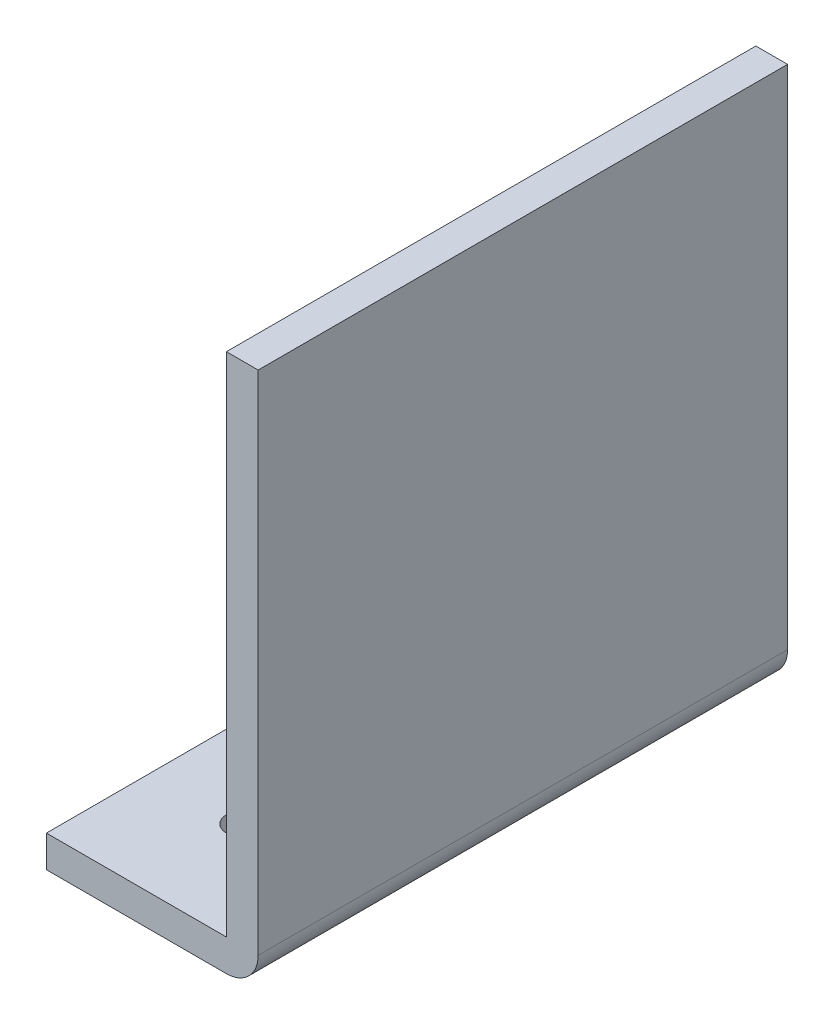
ISO-10303-21;
HEADER;
FILE_DESCRIPTION(('STEP AP214'),'2;1');
FILE_NAME('part.step','',(''),(''),'','','');
FILE_SCHEMA(('AUTOMOTIVE_DESIGN { 1 0 10303 214 1 1 1 1 }'));
ENDSEC;
DATA;
#1=APPLICATION_CONTEXT('core data for automotive mechanical design processes');
#2=APPLICATION_PROTOCOL_DEFINITION('international standard','automotive_design',2000,#1);
#3=PRODUCT_CONTEXT('',#1,'mechanical');
#4=PRODUCT('Part','Part','',(#3));
#5=PRODUCT_RELATED_PRODUCT_CATEGORY('part','',(#4));
#6=PRODUCT_DEFINITION_FORMATION('','',#4);
#7=PRODUCT_DEFINITION_CONTEXT('part definition',#1,'design');
#8=PRODUCT_DEFINITION('design','',#6,#7);
#9=PRODUCT_DEFINITION_SHAPE('','',#8);
#10=(LENGTH_UNIT() NAMED_UNIT(*) SI_UNIT(.MILLI.,.METRE.));
#11=(NAMED_UNIT(*) PLANE_ANGLE_UNIT() SI_UNIT($,.RADIAN.));
#12=(NAMED_UNIT(*) SI_UNIT($,.STERADIAN.) SOLID_ANGLE_UNIT());
#13=UNCERTAINTY_MEASURE_WITH_UNIT(LENGTH_MEASURE(1.E-05),#10,'distance_accuracy_value','');
#14=(GEOMETRIC_REPRESENTATION_CONTEXT(3) GLOBAL_UNCERTAINTY_ASSIGNED_CONTEXT((#13)) GLOBAL_UNIT_ASSIGNED_CONTEXT((#10,
#11,#12)) REPRESENTATION_CONTEXT('',''));
#15=CARTESIAN_POINT('',(0.,0.,0.));
#16=DIRECTION('',(0.,0.,1.));
#17=DIRECTION('',(1.,0.,0.));
#18=AXIS2_PLACEMENT_3D('',#15,#16,#17);
#19=CARTESIAN_POINT('',(-20.,3.,25.));
#20=DIRECTION('',(1.,0.,0.));
#21=DIRECTION('',(0.,0.,-1.));
#22=AXIS2_PLACEMENT_3D('',#19,#20,#21);
#23=PLANE('',#22);
#24=DIRECTION('',(0.,-1.,0.));
#25=VECTOR('',#24,1.);
#26=CARTESIAN_POINT('',(-20.,3.,-25.));
#27=LINE('',#26,#25);
#28=CARTESIAN_POINT('',(-20.,3.,-25.));
#29=VERTEX_POINT('',#28);
#30=CARTESIAN_POINT('',(-20.,0.,-25.));
#31=VERTEX_POINT('',#30);
#32=EDGE_CURVE('E133',#29,#31,#27,.T.);
#33=ORIENTED_EDGE('',*,*,#32,.T.);
#34=DIRECTION('',(0.,0.,-1.));
#35=VECTOR('',#34,1.);
#36=CARTESIAN_POINT('',(-20.,0.,25.));
#37=LINE('',#36,#35);
#38=CARTESIAN_POINT('',(-20.,0.,25.));
#39=VERTEX_POINT('',#38);
#40=EDGE_CURVE('E11',#39,#31,#37,.T.);
#41=ORIENTED_EDGE('',*,*,#40,.F.);
#42=DIRECTION('',(0.,-1.,0.));
#43=VECTOR('',#42,1.);
#44=CARTESIAN_POINT('',(-20.,3.,25.));
#45=LINE('',#44,#43);
#46=CARTESIAN_POINT('',(-20.,3.,25.));
#47=VERTEX_POINT('',#46);
#48=EDGE_CURVE('E146',#47,#39,#45,.T.);
#49=ORIENTED_EDGE('',*,*,#48,.F.);
#50=DIRECTION('',(0.,0.,-1.));
#51=VECTOR('',#50,1.);
#52=CARTESIAN_POINT('',(-20.,3.,25.));
#53=LINE('',#52,#51);
#54=EDGE_CURVE('E129',#47,#29,#53,.T.);
#55=ORIENTED_EDGE('',*,*,#54,.T.);
#56=EDGE_LOOP('',(#33,#41,#49,#55));
#57=FACE_BOUND('',#56,.T.);
#58=ADVANCED_FACE('F43',(#57),#23,.F.);
#59=CARTESIAN_POINT('',(-20.,0.,25.));
#60=DIRECTION('',(0.,1.,0.));
#61=DIRECTION('',(0.,0.,1.));
#62=AXIS2_PLACEMENT_3D('',#59,#60,#61);
#63=PLANE('',#62);
#64=CARTESIAN_POINT('',(-11.5,0.,-15.));
#65=DIRECTION('',(0.,1.,0.));
#66=DIRECTION('',(0.,0.,1.));
#67=AXIS2_PLACEMENT_3D('',#64,#65,#66);
#68=CIRCLE('',#67,1.5);
#69=CARTESIAN_POINT('',(-11.5,0.,-13.5));
#70=VERTEX_POINT('',#69);
#71=EDGE_CURVE('E137',#70,#70,#68,.T.);
#72=ORIENTED_EDGE('',*,*,#71,.T.);
#73=EDGE_LOOP('',(#72));
#74=FACE_BOUND('',#73,.T.);
#75=CARTESIAN_POINT('',(-11.5,0.,15.));
#76=DIRECTION('',(0.,1.,0.));
#77=DIRECTION('',(0.,0.,1.));
#78=AXIS2_PLACEMENT_3D('',#75,#76,#77);
#79=CIRCLE('',#78,1.5);
#80=CARTESIAN_POINT('',(-11.5,0.,16.5));
#81=VERTEX_POINT('',#80);
#82=EDGE_CURVE('E171',#81,#81,#79,.T.);
#83=ORIENTED_EDGE('',*,*,#82,.T.);
#84=EDGE_LOOP('',(#83));
#85=FACE_BOUND('',#84,.T.);
#86=DIRECTION('',(1.,0.,0.));
#87=VECTOR('',#86,1.);
#88=CARTESIAN_POINT('',(-20.,0.,-25.));
#89=LINE('',#88,#87);
#90=CARTESIAN_POINT('',(-3.00000000000002,0.,-25.));
#91=VERTEX_POINT('',#90);
#92=EDGE_CURVE('E136',#31,#91,#89,.T.);
#93=ORIENTED_EDGE('',*,*,#92,.T.);
#94=DIRECTION('',(0.,0.,-1.));
#95=VECTOR('',#94,1.);
#96=CARTESIAN_POINT('',(-3.00000000000002,0.,25.));
#97=LINE('',#96,#95);
#98=CARTESIAN_POINT('',(-3.00000000000002,0.,25.));
#99=VERTEX_POINT('',#98);
#100=EDGE_CURVE('E51',#99,#91,#97,.T.);
#101=ORIENTED_EDGE('',*,*,#100,.F.);
#102=DIRECTION('',(1.,0.,0.));
#103=VECTOR('',#102,1.);
#104=CARTESIAN_POINT('',(-20.,0.,25.));
#105=LINE('',#104,#103);
#106=EDGE_CURVE('E99',#39,#99,#105,.T.);
#107=ORIENTED_EDGE('',*,*,#106,.F.);
#108=ORIENTED_EDGE('',*,*,#40,.T.);
#109=EDGE_LOOP('',(#93,#101,#107,#108));
#110=FACE_BOUND('',#109,.T.);
#111=ADVANCED_FACE('F196',(#74,#85,#110),#63,.F.);
#112=CARTESIAN_POINT('',(-3.,3.,25.));
#113=DIRECTION('',(0.,0.,-1.));
#114=DIRECTION('',(-1.,0.,0.));
#115=AXIS2_PLACEMENT_3D('',#112,#113,#114);
#116=CYLINDRICAL_SURFACE('',#115,3.);
#117=CARTESIAN_POINT('',(-3.,3.,-25.));
#118=DIRECTION('',(0.,0.,1.));
#119=DIRECTION('',(1.,0.,0.));
#120=AXIS2_PLACEMENT_3D('',#117,#118,#119);
#121=CIRCLE('',#120,3.);
#122=CARTESIAN_POINT('',(0.,3.,-25.));
#123=VERTEX_POINT('',#122);
#124=EDGE_CURVE('E139',#91,#123,#121,.T.);
#125=ORIENTED_EDGE('',*,*,#124,.T.);
#126=DIRECTION('',(0.,0.,-1.));
#127=VECTOR('',#126,1.);
#128=CARTESIAN_POINT('',(0.,3.,25.));
#129=LINE('',#128,#127);
#130=CARTESIAN_POINT('',(0.,3.,25.));
#131=VERTEX_POINT('',#130);
#132=EDGE_CURVE('E150',#131,#123,#129,.T.);
#133=ORIENTED_EDGE('',*,*,#132,.F.);
#134=CARTESIAN_POINT('',(-3.,3.,25.));
#135=DIRECTION('',(0.,0.,1.));
#136=DIRECTION('',(1.,0.,0.));
#137=AXIS2_PLACEMENT_3D('',#134,#135,#136);
#138=CIRCLE('',#137,3.);
#139=EDGE_CURVE('E158',#99,#131,#138,.T.);
#140=ORIENTED_EDGE('',*,*,#139,.F.);
#141=ORIENTED_EDGE('',*,*,#100,.T.);
#142=EDGE_LOOP('',(#125,#133,#140,#141));
#143=FACE_BOUND('',#142,.T.);
#144=ADVANCED_FACE('F156',(#143),#116,.T.);
#145=CARTESIAN_POINT('',(0.,3.00000000000002,25.));
#146=DIRECTION('',(-1.,0.,0.));
#147=DIRECTION('',(0.,0.,1.));
#148=AXIS2_PLACEMENT_3D('',#145,#146,#147);
#149=PLANE('',#148);
#150=DIRECTION('',(0.,1.,0.));
#151=VECTOR('',#150,1.);
#152=CARTESIAN_POINT('',(0.,3.00000000000002,-25.));
#153=LINE('',#152,#151);
#154=CARTESIAN_POINT('',(0.,50.87,-25.));
#155=VERTEX_POINT('',#154);
#156=EDGE_CURVE('E141',#123,#155,#153,.T.);
#157=ORIENTED_EDGE('',*,*,#156,.T.);
#158=DIRECTION('',(0.,0.,-1.));
#159=VECTOR('',#158,1.);
#160=CARTESIAN_POINT('',(0.,50.87,25.));
#161=LINE('',#160,#159);
#162=CARTESIAN_POINT('',(0.,50.87,25.));
#163=VERTEX_POINT('',#162);
#164=EDGE_CURVE('E124',#163,#155,#161,.T.);
#165=ORIENTED_EDGE('',*,*,#164,.F.);
#166=DIRECTION('',(0.,1.,0.));
#167=VECTOR('',#166,1.);
#168=CARTESIAN_POINT('',(0.,3.00000000000002,25.));
#169=LINE('',#168,#167);
#170=EDGE_CURVE('E115',#131,#163,#169,.T.);
#171=ORIENTED_EDGE('',*,*,#170,.F.);
#172=ORIENTED_EDGE('',*,*,#132,.T.);
#173=EDGE_LOOP('',(#157,#165,#171,#172));
#174=FACE_BOUND('',#173,.T.);
#175=ADVANCED_FACE('F164',(#174),#149,.F.);
#176=CARTESIAN_POINT('',(-3.,50.87,25.));
#177=DIRECTION('',(0.,-1.,0.));
#178=DIRECTION('',(0.,0.,-1.));
#179=AXIS2_PLACEMENT_3D('',#176,#177,#178);
#180=PLANE('',#179);
#181=DIRECTION('',(-1.,0.,0.));
#182=VECTOR('',#181,1.);
#183=CARTESIAN_POINT('',(-3.,50.87,-25.));
#184=LINE('',#183,#182);
#185=CARTESIAN_POINT('',(-3.,50.87,-25.));
#186=VERTEX_POINT('',#185);
#187=EDGE_CURVE('E123',#155,#186,#184,.T.);
#188=ORIENTED_EDGE('',*,*,#187,.T.);
#189=DIRECTION('',(0.,0.,-1.));
#190=VECTOR('',#189,1.);
#191=CARTESIAN_POINT('',(-3.,50.87,25.));
#192=LINE('',#191,#190);
#193=CARTESIAN_POINT('',(-3.,50.87,25.));
#194=VERTEX_POINT('',#193);
#195=EDGE_CURVE('E120',#194,#186,#192,.T.);
#196=ORIENTED_EDGE('',*,*,#195,.F.);
#197=DIRECTION('',(-1.,0.,0.));
#198=VECTOR('',#197,1.);
#199=CARTESIAN_POINT('',(-3.,50.87,25.));
#200=LINE('',#199,#198);
#201=EDGE_CURVE('E109',#163,#194,#200,.T.);
#202=ORIENTED_EDGE('',*,*,#201,.F.);
#203=ORIENTED_EDGE('',*,*,#164,.T.);
#204=EDGE_LOOP('',(#188,#196,#202,#203));
#205=FACE_BOUND('',#204,.T.);
#206=ADVANCED_FACE('F121',(#205),#180,.F.);
#207=CARTESIAN_POINT('',(-3.00000000000002,3.,25.));
#208=DIRECTION('',(1.,0.,0.));
#209=DIRECTION('',(0.,1.,0.));
#210=AXIS2_PLACEMENT_3D('',#207,#208,#209);
#211=PLANE('',#210);
#212=DIRECTION('',(0.,-1.,0.));
#213=VECTOR('',#212,1.);
#214=CARTESIAN_POINT('',(-3.00000000000002,3.,-25.));
#215=LINE('',#214,#213);
#216=CARTESIAN_POINT('',(-3.00000000000002,3.,-25.));
#217=VERTEX_POINT('',#216);
#218=EDGE_CURVE('E85',#186,#217,#215,.T.);
#219=ORIENTED_EDGE('',*,*,#218,.T.);
#220=DIRECTION('',(0.,0.,-1.));
#221=VECTOR('',#220,1.);
#222=CARTESIAN_POINT('',(-3.00000000000002,3.,25.));
#223=LINE('',#222,#221);
#224=CARTESIAN_POINT('',(-3.00000000000002,3.,25.));
#225=VERTEX_POINT('',#224);
#226=EDGE_CURVE('E125',#225,#217,#223,.T.);
#227=ORIENTED_EDGE('',*,*,#226,.F.);
#228=DIRECTION('',(0.,-1.,0.));
#229=VECTOR('',#228,1.);
#230=CARTESIAN_POINT('',(-3.00000000000002,3.,25.));
#231=LINE('',#230,#229);
#232=EDGE_CURVE('E113',#194,#225,#231,.T.);
#233=ORIENTED_EDGE('',*,*,#232,.F.);
#234=ORIENTED_EDGE('',*,*,#195,.T.);
#235=EDGE_LOOP('',(#219,#227,#233,#234));
#236=FACE_BOUND('',#235,.T.);
#237=ADVANCED_FACE('F127',(#236),#211,.F.);
#238=CARTESIAN_POINT('',(-20.,3.,25.));
#239=DIRECTION('',(0.,-1.,0.));
#240=DIRECTION('',(0.,0.,-1.));
#241=AXIS2_PLACEMENT_3D('',#238,#239,#240);
#242=PLANE('',#241);
#243=CARTESIAN_POINT('',(-11.5,3.,-15.));
#244=DIRECTION('',(0.,1.,0.));
#245=DIRECTION('',(0.,0.,1.));
#246=AXIS2_PLACEMENT_3D('',#243,#244,#245);
#247=CIRCLE('',#246,1.5);
#248=CARTESIAN_POINT('',(-11.5,3.,-13.5));
#249=VERTEX_POINT('',#248);
#250=EDGE_CURVE('E174',#249,#249,#247,.T.);
#251=ORIENTED_EDGE('',*,*,#250,.F.);
#252=EDGE_LOOP('',(#251));
#253=FACE_BOUND('',#252,.T.);
#254=CARTESIAN_POINT('',(-11.5,3.,15.));
#255=DIRECTION('',(0.,1.,0.));
#256=DIRECTION('',(0.,0.,1.));
#257=AXIS2_PLACEMENT_3D('',#254,#255,#256);
#258=CIRCLE('',#257,1.5);
#259=CARTESIAN_POINT('',(-11.5,3.,16.5));
#260=VERTEX_POINT('',#259);
#261=EDGE_CURVE('E175',#260,#260,#258,.T.);
#262=ORIENTED_EDGE('',*,*,#261,.F.);
#263=EDGE_LOOP('',(#262));
#264=FACE_BOUND('',#263,.T.);
#265=DIRECTION('',(-1.,0.,0.));
#266=VECTOR('',#265,1.);
#267=CARTESIAN_POINT('',(-20.,3.,-25.));
#268=LINE('',#267,#266);
#269=EDGE_CURVE('E91',#217,#29,#268,.T.);
#270=ORIENTED_EDGE('',*,*,#269,.T.);
#271=ORIENTED_EDGE('',*,*,#54,.F.);
#272=DIRECTION('',(-1.,0.,0.));
#273=VECTOR('',#272,1.);
#274=CARTESIAN_POINT('',(-20.,3.,25.));
#275=LINE('',#274,#273);
#276=EDGE_CURVE('E59',#225,#47,#275,.T.);
#277=ORIENTED_EDGE('',*,*,#276,.F.);
#278=ORIENTED_EDGE('',*,*,#226,.T.);
#279=EDGE_LOOP('',(#270,#271,#277,#278));
#280=FACE_BOUND('',#279,.T.);
#281=ADVANCED_FACE('F184',(#253,#264,#280),#242,.F.);
#282=CARTESIAN_POINT('',(-3.,3.,25.));
#283=DIRECTION('',(0.,0.,1.));
#284=DIRECTION('',(1.,0.,0.));
#285=AXIS2_PLACEMENT_3D('',#282,#283,#284);
#286=PLANE('',#285);
#287=ORIENTED_EDGE('',*,*,#48,.T.);
#288=ORIENTED_EDGE('',*,*,#106,.T.);
#289=ORIENTED_EDGE('',*,*,#139,.T.);
#290=ORIENTED_EDGE('',*,*,#170,.T.);
#291=ORIENTED_EDGE('',*,*,#201,.T.);
#292=ORIENTED_EDGE('',*,*,#232,.T.);
#293=ORIENTED_EDGE('',*,*,#276,.T.);
#294=EDGE_LOOP('',(#287,#288,#289,#290,#291,#292,#293));
#295=FACE_BOUND('',#294,.T.);
#296=ADVANCED_FACE('F111',(#295),#286,.T.);
#297=CARTESIAN_POINT('',(-3.,3.,-25.));
#298=DIRECTION('',(0.,0.,1.));
#299=DIRECTION('',(1.,0.,0.));
#300=AXIS2_PLACEMENT_3D('',#297,#298,#299);
#301=PLANE('',#300);
#302=ORIENTED_EDGE('',*,*,#32,.F.);
#303=ORIENTED_EDGE('',*,*,#269,.F.);
#304=ORIENTED_EDGE('',*,*,#218,.F.);
#305=ORIENTED_EDGE('',*,*,#187,.F.);
#306=ORIENTED_EDGE('',*,*,#156,.F.);
#307=ORIENTED_EDGE('',*,*,#124,.F.);
#308=ORIENTED_EDGE('',*,*,#92,.F.);
#309=EDGE_LOOP('',(#302,#303,#304,#305,#306,#307,#308));
#310=FACE_BOUND('',#309,.T.);
#311=ADVANCED_FACE('F162',(#310),#301,.F.);
#312=CARTESIAN_POINT('',(-11.5,-47.,15.));
#313=DIRECTION('',(0.,1.,0.));
#314=DIRECTION('',(0.,0.,1.));
#315=AXIS2_PLACEMENT_3D('',#312,#313,#314);
#316=CYLINDRICAL_SURFACE('',#315,1.5);
#317=ORIENTED_EDGE('',*,*,#261,.T.);
#318=EDGE_LOOP('',(#317));
#319=FACE_BOUND('',#318,.T.);
#320=ORIENTED_EDGE('',*,*,#82,.F.);
#321=EDGE_LOOP('',(#320));
#322=FACE_BOUND('',#321,.T.);
#323=ADVANCED_FACE('F190',(#319,#322),#316,.F.);
#324=CARTESIAN_POINT('',(-11.5,-47.,-15.));
#325=DIRECTION('',(0.,1.,0.));
#326=DIRECTION('',(0.,0.,1.));
#327=AXIS2_PLACEMENT_3D('',#324,#325,#326);
#328=CYLINDRICAL_SURFACE('',#327,1.5);
#329=ORIENTED_EDGE('',*,*,#250,.T.);
#330=EDGE_LOOP('',(#329));
#331=FACE_BOUND('',#330,.T.);
#332=ORIENTED_EDGE('',*,*,#71,.F.);
#333=EDGE_LOOP('',(#332));
#334=FACE_BOUND('',#333,.T.);
#335=ADVANCED_FACE('F181',(#331,#334),#328,.F.);
#336=CLOSED_SHELL('',(#58,#111,#144,#175,#206,#237,#281,#296,#311,#323,#335));
#337=MANIFOLD_SOLID_BREP('B2',#336);
#338=ADVANCED_BREP_SHAPE_REPRESENTATION('',(#18,#337),#14);
#339=SHAPE_DEFINITION_REPRESENTATION(#9,#338);
ENDSEC;
END-ISO-10303-21;
